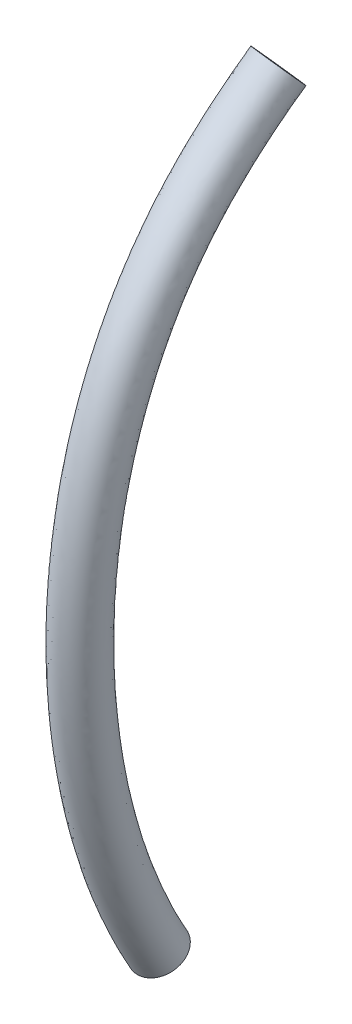
ISO-10303-21;
HEADER;
FILE_DESCRIPTION(('STEP AP214'),'2;1');
FILE_NAME('part.step','',(''),(''),'','','');
FILE_SCHEMA(('AUTOMOTIVE_DESIGN { 1 0 10303 214 1 1 1 1 }'));
ENDSEC;
DATA;
#1=APPLICATION_CONTEXT('core data for automotive mechanical design processes');
#2=APPLICATION_PROTOCOL_DEFINITION('international standard','automotive_design',2000,#1);
#3=PRODUCT_CONTEXT('',#1,'mechanical');
#4=PRODUCT('Part','Part','',(#3));
#5=PRODUCT_RELATED_PRODUCT_CATEGORY('part','',(#4));
#6=PRODUCT_DEFINITION_FORMATION('','',#4);
#7=PRODUCT_DEFINITION_CONTEXT('part definition',#1,'design');
#8=PRODUCT_DEFINITION('design','',#6,#7);
#9=PRODUCT_DEFINITION_SHAPE('','',#8);
#10=(LENGTH_UNIT() NAMED_UNIT(*) SI_UNIT(.MILLI.,.METRE.));
#11=(NAMED_UNIT(*) PLANE_ANGLE_UNIT() SI_UNIT($,.RADIAN.));
#12=(NAMED_UNIT(*) SI_UNIT($,.STERADIAN.) SOLID_ANGLE_UNIT());
#13=UNCERTAINTY_MEASURE_WITH_UNIT(LENGTH_MEASURE(1.E-05),#10,'distance_accuracy_value','');
#14=(GEOMETRIC_REPRESENTATION_CONTEXT(3) GLOBAL_UNCERTAINTY_ASSIGNED_CONTEXT((#13)) GLOBAL_UNIT_ASSIGNED_CONTEXT((#10,
#11,#12)) REPRESENTATION_CONTEXT('',''));
#15=CARTESIAN_POINT('',(0.,0.,0.));
#16=DIRECTION('',(0.,0.,1.));
#17=DIRECTION('',(1.,0.,0.));
#18=AXIS2_PLACEMENT_3D('',#15,#16,#17);
#19=CARTESIAN_POINT('',(-51.3563593394704,3.06598832373373,35.610996379204));
#20=DIRECTION('',(-0.0874038174105475,-0.6694764090875,0.737673308706076));
#21=DIRECTION('',(0.,-0.740507257196063,-0.672048362872765));
#22=AXIS2_PLACEMENT_3D('',#19,#20,#21);
#23=PLANE('',#22);
#24=CARTESIAN_POINT('',(-51.3563593394704,3.06598832373373,35.610996379204));
#25=DIRECTION('',(-0.0874038174105475,-0.6694764090875,0.737673308706076));
#26=DIRECTION('',(0.,-0.740507257196063,-0.672048362872765));
#27=AXIS2_PLACEMENT_3D('',#24,#25,#26);
#28=CIRCLE('',#27,1.15);
#29=CARTESIAN_POINT('',(-51.3563593394704,2.21440497795825,34.8381407619003));
#30=VERTEX_POINT('',#29);
#31=EDGE_CURVE('E48',#30,#30,#28,.T.);
#32=ORIENTED_EDGE('',*,*,#31,.F.);
#33=EDGE_LOOP('',(#32));
#34=FACE_BOUND('',#33,.T.);
#35=ADVANCED_FACE('F41',(#34),#23,.F.);
#36=CARTESIAN_POINT('',(-52.3563593394295,-31.6895786589908,40.3387696776157));
#37=DIRECTION('',(0.0370741325211034,-0.875177861916726,-0.482378708805309));
#38=DIRECTION('',(0.52652583870124,0.427379863966911,-0.734926522215372));
#39=AXIS2_PLACEMENT_3D('',#36,#37,#38);
#40=PLANE('',#39);
#41=CARTESIAN_POINT('',(-52.3563593394295,-31.6895786589908,40.3387696776157));
#42=DIRECTION('',(0.0370741325211034,-0.875177861916726,-0.482378708805309));
#43=DIRECTION('',(0.52652583870124,0.427379863966911,-0.734926522215372));
#44=AXIS2_PLACEMENT_3D('',#41,#42,#43);
#45=CIRCLE('',#44,1.15);
#46=CARTESIAN_POINT('',(-51.7508546249231,-31.1980918154288,39.493604177068));
#47=VERTEX_POINT('',#46);
#48=EDGE_CURVE('E12',#47,#47,#45,.T.);
#49=ORIENTED_EDGE('',*,*,#48,.T.);
#50=EDGE_LOOP('',(#49));
#51=FACE_BOUND('',#50,.T.);
#52=ADVANCED_FACE('F55',(#51),#40,.T.);
#53=CARTESIAN_POINT('',(-51.3563593394704,2.21440497795825,34.8381407619003));
#54=CARTESIAN_POINT('',(-51.5578981263373,0.670702749020412,36.5390938146878));
#55=CARTESIAN_POINT('',(-51.4258494533282,-0.581032962064383,38.2236003297848));
#56=CARTESIAN_POINT('',(-51.2811254004193,-3.74068071884167,40.9840762367639));
#57=CARTESIAN_POINT('',(-51.306477800006,-5.88869062490953,42.031490140607));
#58=CARTESIAN_POINT('',(-51.4524099769712,-10.7048087706579,43.316378668838));
#59=CARTESIAN_POINT('',(-51.5722973327524,-13.3672714416203,43.54902143039));
#60=CARTESIAN_POINT('',(-51.8883148798506,-21.4957595837425,43.2333294420253));
#61=CARTESIAN_POINT('',(-52.0287117653134,-27.1061410530127,41.6741192993613));
#62=CARTESIAN_POINT('',(-51.7508546249231,-31.1980918154288,39.493604177068));
#63=CARTESIAN_POINT('',(-49.0651615240049,2.0793039154392,34.9870040324283));
#64=CARTESIAN_POINT('',(-49.2472824848706,0.684334061853988,36.5240739330503));
#65=CARTESIAN_POINT('',(-49.1284448498378,-0.511964937402938,38.1174592961616));
#66=CARTESIAN_POINT('',(-48.9799416909378,-3.7309236872771,41.0067812045873));
#67=CARTESIAN_POINT('',(-49.0068534459112,-5.91532495594459,42.115031541636));
#68=CARTESIAN_POINT('',(-49.1638127170405,-10.792716066118,43.5412244212188));
#69=CARTESIAN_POINT('',(-49.2930727611004,-13.4821593234453,43.8573529618484));
#70=CARTESIAN_POINT('',(-49.675055733976,-21.717596908064,43.8616613449797));
#71=CARTESIAN_POINT('',(-49.946937131016,-27.455301124445,42.6238255546774));
#72=CARTESIAN_POINT('',(-49.7973487754684,-31.7195894246079,40.5898957166536));
#73=CARTESIAN_POINT('',(-49.0651615240049,3.78247060699015,36.5327152670357));
#74=CARTESIAN_POINT('',(-49.2342351124258,2.48743814995932,37.9596675431318));
#75=CARTESIAN_POINT('',(-49.1034093865244,1.25969140396183,39.6236141288487));
#76=CARTESIAN_POINT('',(-48.9919846702283,-2.53113846328524,43.0128632556412));
#77=CARTESIAN_POINT('',(-49.0690606399675,-5.05006080591656,44.2644372415019));
#78=CARTESIAN_POINT('',(-49.3699498888934,-10.4666536824294,45.8267631845168));
#79=CARTESIAN_POINT('',(-49.5943605383736,-13.3720687755673,46.1453648647823));
#80=CARTESIAN_POINT('',(-50.3333714982354,-22.1520938039081,46.0660668632766));
#81=CARTESIAN_POINT('',(-50.962884024972,-28.1085738475937,44.6456359754865));
#82=CARTESIAN_POINT('',(-51.0083582044813,-32.7025631117318,42.280226717749));
#83=CARTESIAN_POINT('',(-51.3563593394704,3.9175716695092,36.3838519965076));
#84=CARTESIAN_POINT('',(-51.5448507538887,2.47380683712429,37.9746874247694));
#85=CARTESIAN_POINT('',(-51.4008139900149,1.19062337929949,39.729755162472));
#86=CARTESIAN_POINT('',(-51.2931683797098,-2.54089549484873,42.9901582878178));
#87=CARTESIAN_POINT('',(-51.3686849940669,-5.02342647488377,44.1808958404683));
#88=CARTESIAN_POINT('',(-51.6585471488195,-10.3787463869669,45.6019174321406));
#89=CARTESIAN_POINT('',(-51.8735851100255,-13.2571808937423,45.8370333333239));
#90=CARTESIAN_POINT('',(-52.5466306441099,-21.9302564795867,45.4377349603222));
#91=CARTESIAN_POINT('',(-53.0446586592778,-27.7594137761487,43.6959297201957));
#92=CARTESIAN_POINT('',(-52.9618640539359,-32.1810655025527,41.1839351781633));
#93=CARTESIAN_POINT('',(-53.647557154936,4.05267273202825,36.2349887259796));
#94=CARTESIAN_POINT('',(-53.8554663953516,2.46017552428926,37.9897073064069));
#95=CARTESIAN_POINT('',(-53.6982185935053,1.12155535463715,39.8358961960952));
#96=CARTESIAN_POINT('',(-53.5943520891913,-2.55065252641221,42.9674533199945));
#97=CARTESIAN_POINT('',(-53.6683093481664,-4.996792143851,44.0973544394347));
#98=CARTESIAN_POINT('',(-53.9471444087457,-10.2908390915045,45.3770716797644));
#99=CARTESIAN_POINT('',(-54.1528096816775,-13.1422930119173,45.5287018018656));
#100=CARTESIAN_POINT('',(-54.7598897899845,-21.7084191552652,44.8094030573678));
#101=CARTESIAN_POINT('',(-55.1264332935836,-27.4102537047037,42.7462234649049));
#102=CARTESIAN_POINT('',(-54.9153699033905,-31.6595678933736,40.0876436385777));
#103=CARTESIAN_POINT('',(-53.647557154936,2.34950604047731,34.6892774913722));
#104=CARTESIAN_POINT('',(-53.8685137678041,0.657071436186836,36.5541136963254));
#105=CARTESIAN_POINT('',(-53.7232540568187,-0.650100986725829,38.3297413634081));
#106=CARTESIAN_POINT('',(-53.5823091099008,-3.75043775040624,40.9613712689406));
#107=CARTESIAN_POINT('',(-53.6061021541009,-5.86205629387447,41.947948739578));
#108=CARTESIAN_POINT('',(-53.7410072369019,-10.6169014751977,43.0915329164573));
#109=CARTESIAN_POINT('',(-53.8515219044043,-13.2523835597953,43.2406898989316));
#110=CARTESIAN_POINT('',(-54.1015740257251,-21.273922259421,42.6049975390708));
#111=CARTESIAN_POINT('',(-54.1104863996108,-26.7569809815803,40.7244130440452));
#112=CARTESIAN_POINT('',(-53.7043604743777,-30.6765942062497,38.3973126374823));
#113=CARTESIAN_POINT('',(-51.3563593394704,2.21440497795825,34.8381407619003));
#114=CARTESIAN_POINT('',(-51.5578981263373,0.670702749020412,36.5390938146878));
#115=CARTESIAN_POINT('',(-51.4258494533282,-0.581032962064383,38.2236003297848));
#116=CARTESIAN_POINT('',(-51.2811254004193,-3.74068071884167,40.9840762367639));
#117=CARTESIAN_POINT('',(-51.306477800006,-5.88869062490953,42.031490140607));
#118=CARTESIAN_POINT('',(-51.4524099769712,-10.7048087706579,43.316378668838));
#119=CARTESIAN_POINT('',(-51.5722973327524,-13.3672714416203,43.54902143039));
#120=CARTESIAN_POINT('',(-51.8883148798506,-21.4957595837425,43.2333294420253));
#121=CARTESIAN_POINT('',(-52.0287117653134,-27.1061410530127,41.6741192993613));
#122=CARTESIAN_POINT('',(-51.7508546249231,-31.1980918154288,39.493604177068));
#123=(BOUNDED_SURFACE() B_SPLINE_SURFACE(3,3,((#53,#54,#55,#56,#57,#58,#59,#60,#61,#62),(#63,
#64,#65,#66,#67,#68,#69,#70,#71,#72),(#73,#74,#75,#76,#77,#78,#79,#80,#81,#82),(#83,#84,#85,#86,
#87,#88,#89,#90,#91,#92),(#93,#94,#95,#96,#97,#98,#99,#100,#101,#102),(#103,#104,#105,#106,#107,
#108,#109,#110,#111,#112),(#113,#114,#115,#116,#117,#118,#119,#120,#121,#122)),.UNSPECIFIED.,
.T.,.F.,.F.) B_SPLINE_SURFACE_WITH_KNOTS((4,3,4),(4,2,2,2,4),(0.,0.5,1.),(0.,0.170666857107264,
0.378000142830448,0.585333428553632,1.),
.UNSPECIFIED.) GEOMETRIC_REPRESENTATION_ITEM() RATIONAL_B_SPLINE_SURFACE(((1.,1.,1.,1.,1.,1.,1.,
1.,1.,1.),(0.333333333333333,0.333333333333333,0.333333333333333,0.333333333333333,
0.333333333333333,0.333333333333333,0.333333333333333,0.333333333333333,0.333333333333333,
0.333333333333333),(0.333333333333333,0.333333333333333,0.333333333333333,0.333333333333333,
0.333333333333333,0.333333333333333,0.333333333333333,0.333333333333333,0.333333333333333,
0.333333333333333),(1.,1.,1.,1.,1.,1.,1.,1.,1.,1.),(0.333333333333333,0.333333333333333,
0.333333333333333,0.333333333333333,0.333333333333333,0.333333333333333,0.333333333333333,
0.333333333333333,0.333333333333333,0.333333333333333),(0.333333333333333,0.333333333333333,
0.333333333333333,0.333333333333333,0.333333333333333,0.333333333333333,0.333333333333333,
0.333333333333333,0.333333333333333,0.333333333333333),(1.,1.,1.,1.,1.,1.,1.,1.,1.,1.))) REPRESENTATION_ITEM('') SURFACE());
#124=ORIENTED_EDGE('',*,*,#48,.F.);
#125=EDGE_LOOP('',(#124));
#126=FACE_BOUND('',#125,.T.);
#127=ORIENTED_EDGE('',*,*,#31,.T.);
#128=EDGE_LOOP('',(#127));
#129=FACE_BOUND('',#128,.T.);
#130=ADVANCED_FACE('F57',(#126,#129),#123,.T.);
#131=CLOSED_SHELL('',(#35,#52,#130));
#132=MANIFOLD_SOLID_BREP('B2',#131);
#133=ADVANCED_BREP_SHAPE_REPRESENTATION('',(#18,#132),#14);
#134=SHAPE_DEFINITION_REPRESENTATION(#9,#133);
ENDSEC;
END-ISO-10303-21;
